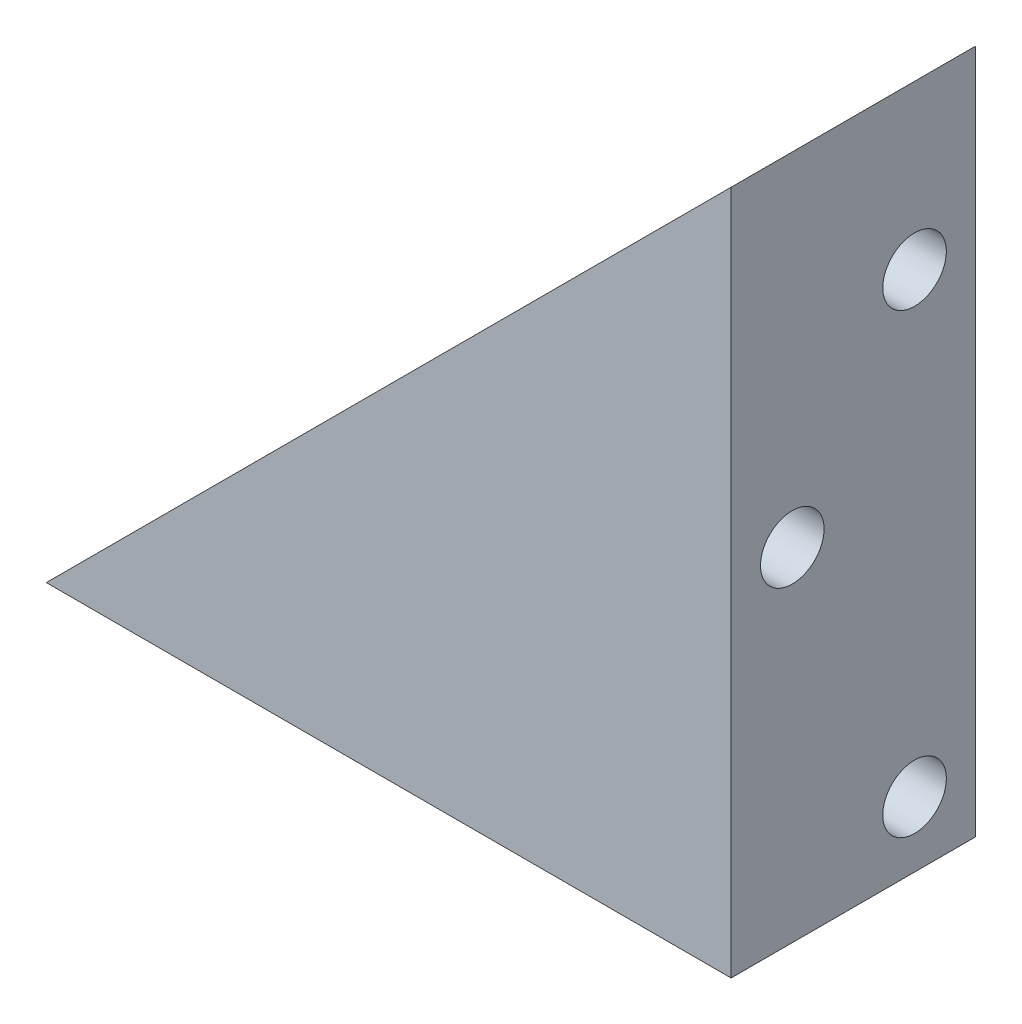
ISO-10303-21;
HEADER;
FILE_DESCRIPTION(('STEP AP214'),'2;1');
FILE_NAME('part.step','',(''),(''),'','','');
FILE_SCHEMA(('AUTOMOTIVE_DESIGN { 1 0 10303 214 1 1 1 1 }'));
ENDSEC;
DATA;
#1=APPLICATION_CONTEXT('core data for automotive mechanical design processes');
#2=APPLICATION_PROTOCOL_DEFINITION('international standard','automotive_design',2000,#1);
#3=PRODUCT_CONTEXT('',#1,'mechanical');
#4=PRODUCT('Part','Part','',(#3));
#5=PRODUCT_RELATED_PRODUCT_CATEGORY('part','',(#4));
#6=PRODUCT_DEFINITION_FORMATION('','',#4);
#7=PRODUCT_DEFINITION_CONTEXT('part definition',#1,'design');
#8=PRODUCT_DEFINITION('design','',#6,#7);
#9=PRODUCT_DEFINITION_SHAPE('','',#8);
#10=(LENGTH_UNIT() NAMED_UNIT(*) SI_UNIT(.MILLI.,.METRE.));
#11=(NAMED_UNIT(*) PLANE_ANGLE_UNIT() SI_UNIT($,.RADIAN.));
#12=(NAMED_UNIT(*) SI_UNIT($,.STERADIAN.) SOLID_ANGLE_UNIT());
#13=UNCERTAINTY_MEASURE_WITH_UNIT(LENGTH_MEASURE(1.E-05),#10,'distance_accuracy_value','');
#14=(GEOMETRIC_REPRESENTATION_CONTEXT(3) GLOBAL_UNCERTAINTY_ASSIGNED_CONTEXT((#13)) GLOBAL_UNIT_ASSIGNED_CONTEXT((#10,
#11,#12)) REPRESENTATION_CONTEXT('',''));
#15=CARTESIAN_POINT('',(0.,0.,0.));
#16=DIRECTION('',(0.,0.,1.));
#17=DIRECTION('',(1.,0.,0.));
#18=AXIS2_PLACEMENT_3D('',#15,#16,#17);
#19=CARTESIAN_POINT('',(42.,42.,15.));
#20=DIRECTION('',(0.707106781186547,-0.707106781186547,0.));
#21=DIRECTION('',(0.707106781186548,0.707106781186548,0.));
#22=AXIS2_PLACEMENT_3D('',#19,#20,#21);
#23=PLANE('',#22);
#24=CARTESIAN_POINT('',(21.,21.,7.5));
#25=DIRECTION('',(-0.707106781186548,0.707106781186547,0.));
#26=DIRECTION('',(-0.707106781186547,-0.707106781186548,0.));
#27=AXIS2_PLACEMENT_3D('',#24,#25,#26);
#28=CIRCLE('',#27,2.);
#29=CARTESIAN_POINT('',(19.5857864376269,19.5857864376269,7.5));
#30=VERTEX_POINT('',#29);
#31=EDGE_CURVE('E86',#30,#30,#28,.T.);
#32=ORIENTED_EDGE('',*,*,#31,.F.);
#33=EDGE_LOOP('',(#32));
#34=FACE_BOUND('',#33,.T.);
#35=DIRECTION('',(-0.707106781186548,-0.707106781186548,0.));
#36=VECTOR('',#35,1.);
#37=CARTESIAN_POINT('',(42.,42.,0.));
#38=LINE('',#37,#36);
#39=CARTESIAN_POINT('',(42.,42.,0.));
#40=VERTEX_POINT('',#39);
#41=CARTESIAN_POINT('',(0.,0.,0.));
#42=VERTEX_POINT('',#41);
#43=EDGE_CURVE('E79',#40,#42,#38,.T.);
#44=ORIENTED_EDGE('',*,*,#43,.T.);
#45=DIRECTION('',(0.,0.,-1.));
#46=VECTOR('',#45,1.);
#47=CARTESIAN_POINT('',(0.,0.,15.));
#48=LINE('',#47,#46);
#49=CARTESIAN_POINT('',(0.,0.,15.));
#50=VERTEX_POINT('',#49);
#51=EDGE_CURVE('E11',#50,#42,#48,.T.);
#52=ORIENTED_EDGE('',*,*,#51,.F.);
#53=DIRECTION('',(-0.707106781186548,-0.707106781186548,0.));
#54=VECTOR('',#53,1.);
#55=CARTESIAN_POINT('',(42.,42.,15.));
#56=LINE('',#55,#54);
#57=CARTESIAN_POINT('',(42.,42.,15.));
#58=VERTEX_POINT('',#57);
#59=EDGE_CURVE('E72',#58,#50,#56,.T.);
#60=ORIENTED_EDGE('',*,*,#59,.F.);
#61=DIRECTION('',(0.,0.,-1.));
#62=VECTOR('',#61,1.);
#63=CARTESIAN_POINT('',(42.,42.,15.));
#64=LINE('',#63,#62);
#65=EDGE_CURVE('E80',#58,#40,#64,.T.);
#66=ORIENTED_EDGE('',*,*,#65,.T.);
#67=EDGE_LOOP('',(#44,#52,#60,#66));
#68=FACE_BOUND('',#67,.T.);
#69=ADVANCED_FACE('F32',(#34,#68),#23,.F.);
#70=CARTESIAN_POINT('',(0.,0.,15.));
#71=DIRECTION('',(0.,1.,0.));
#72=DIRECTION('',(0.,0.,1.));
#73=AXIS2_PLACEMENT_3D('',#70,#71,#72);
#74=PLANE('',#73);
#75=DIRECTION('',(1.,0.,0.));
#76=VECTOR('',#75,1.);
#77=CARTESIAN_POINT('',(0.,0.,0.));
#78=LINE('',#77,#76);
#79=CARTESIAN_POINT('',(42.,0.,0.));
#80=VERTEX_POINT('',#79);
#81=EDGE_CURVE('E60',#42,#80,#78,.T.);
#82=ORIENTED_EDGE('',*,*,#81,.T.);
#83=DIRECTION('',(0.,0.,-1.));
#84=VECTOR('',#83,1.);
#85=CARTESIAN_POINT('',(42.,0.,15.));
#86=LINE('',#85,#84);
#87=CARTESIAN_POINT('',(42.,0.,15.));
#88=VERTEX_POINT('',#87);
#89=EDGE_CURVE('E40',#88,#80,#86,.T.);
#90=ORIENTED_EDGE('',*,*,#89,.F.);
#91=DIRECTION('',(1.,0.,0.));
#92=VECTOR('',#91,1.);
#93=CARTESIAN_POINT('',(0.,0.,15.));
#94=LINE('',#93,#92);
#95=EDGE_CURVE('E68',#50,#88,#94,.T.);
#96=ORIENTED_EDGE('',*,*,#95,.F.);
#97=ORIENTED_EDGE('',*,*,#51,.T.);
#98=EDGE_LOOP('',(#82,#90,#96,#97));
#99=FACE_BOUND('',#98,.T.);
#100=ADVANCED_FACE('F69',(#99),#74,.F.);
#101=CARTESIAN_POINT('',(42.,0.,15.));
#102=DIRECTION('',(-1.,0.,0.));
#103=DIRECTION('',(0.,0.,1.));
#104=AXIS2_PLACEMENT_3D('',#101,#102,#103);
#105=PLANE('',#104);
#106=CARTESIAN_POINT('',(42.,4.,3.75));
#107=DIRECTION('',(1.,0.,0.));
#108=DIRECTION('',(0.,0.,-1.));
#109=AXIS2_PLACEMENT_3D('',#106,#107,#108);
#110=CIRCLE('',#109,1.95);
#111=CARTESIAN_POINT('',(42.,4.,1.8));
#112=VERTEX_POINT('',#111);
#113=EDGE_CURVE('E128',#112,#112,#110,.T.);
#114=ORIENTED_EDGE('',*,*,#113,.F.);
#115=EDGE_LOOP('',(#114));
#116=FACE_BOUND('',#115,.T.);
#117=CARTESIAN_POINT('',(42.,32.,3.75));
#118=DIRECTION('',(1.,0.,0.));
#119=DIRECTION('',(0.,0.,-1.));
#120=AXIS2_PLACEMENT_3D('',#117,#118,#119);
#121=CIRCLE('',#120,1.95);
#122=CARTESIAN_POINT('',(42.,32.,1.8));
#123=VERTEX_POINT('',#122);
#124=EDGE_CURVE('E122',#123,#123,#121,.T.);
#125=ORIENTED_EDGE('',*,*,#124,.F.);
#126=EDGE_LOOP('',(#125));
#127=FACE_BOUND('',#126,.T.);
#128=CARTESIAN_POINT('',(42.,21.,11.25));
#129=DIRECTION('',(1.,0.,0.));
#130=DIRECTION('',(0.,0.,-1.));
#131=AXIS2_PLACEMENT_3D('',#128,#129,#130);
#132=CIRCLE('',#131,1.95);
#133=CARTESIAN_POINT('',(42.,21.,9.3));
#134=VERTEX_POINT('',#133);
#135=EDGE_CURVE('E116',#134,#134,#132,.T.);
#136=ORIENTED_EDGE('',*,*,#135,.F.);
#137=EDGE_LOOP('',(#136));
#138=FACE_BOUND('',#137,.T.);
#139=DIRECTION('',(0.,1.,0.));
#140=VECTOR('',#139,1.);
#141=CARTESIAN_POINT('',(42.,0.,0.));
#142=LINE('',#141,#140);
#143=EDGE_CURVE('E65',#80,#40,#142,.T.);
#144=ORIENTED_EDGE('',*,*,#143,.T.);
#145=ORIENTED_EDGE('',*,*,#65,.F.);
#146=DIRECTION('',(0.,1.,0.));
#147=VECTOR('',#146,1.);
#148=CARTESIAN_POINT('',(42.,0.,15.));
#149=LINE('',#148,#147);
#150=EDGE_CURVE('E48',#88,#58,#149,.T.);
#151=ORIENTED_EDGE('',*,*,#150,.F.);
#152=ORIENTED_EDGE('',*,*,#89,.T.);
#153=EDGE_LOOP('',(#144,#145,#151,#152));
#154=FACE_BOUND('',#153,.T.);
#155=ADVANCED_FACE('F91',(#116,#127,#138,#154),#105,.F.);
#156=CARTESIAN_POINT('',(0.,0.,15.));
#157=DIRECTION('',(0.,0.,1.));
#158=DIRECTION('',(1.,0.,0.));
#159=AXIS2_PLACEMENT_3D('',#156,#157,#158);
#160=PLANE('',#159);
#161=ORIENTED_EDGE('',*,*,#59,.T.);
#162=ORIENTED_EDGE('',*,*,#95,.T.);
#163=ORIENTED_EDGE('',*,*,#150,.T.);
#164=EDGE_LOOP('',(#161,#162,#163));
#165=FACE_BOUND('',#164,.T.);
#166=ADVANCED_FACE('F75',(#165),#160,.T.);
#167=CARTESIAN_POINT('',(0.,0.,0.));
#168=DIRECTION('',(0.,0.,1.));
#169=DIRECTION('',(1.,0.,0.));
#170=AXIS2_PLACEMENT_3D('',#167,#168,#169);
#171=PLANE('',#170);
#172=ORIENTED_EDGE('',*,*,#43,.F.);
#173=ORIENTED_EDGE('',*,*,#143,.F.);
#174=ORIENTED_EDGE('',*,*,#81,.F.);
#175=EDGE_LOOP('',(#172,#173,#174));
#176=FACE_BOUND('',#175,.T.);
#177=ADVANCED_FACE('F92',(#176),#171,.F.);
#178=CARTESIAN_POINT('',(35.1421356237309,6.85786437626905,7.5));
#179=DIRECTION('',(-0.707106781186548,0.707106781186548,0.));
#180=DIRECTION('',(-0.707106781186547,-0.707106781186548,0.));
#181=AXIS2_PLACEMENT_3D('',#178,#179,#180);
#182=CYLINDRICAL_SURFACE('',#181,2.);
#183=CARTESIAN_POINT('',(35.1421356237309,6.85786437626905,7.5));
#184=DIRECTION('',(-0.707106781186548,0.707106781186547,0.));
#185=DIRECTION('',(-0.707106781186547,-0.707106781186548,0.));
#186=AXIS2_PLACEMENT_3D('',#183,#184,#185);
#187=CIRCLE('',#186,2.);
#188=CARTESIAN_POINT('',(33.7279220613579,5.44365081389595,7.5));
#189=VERTEX_POINT('',#188);
#190=EDGE_CURVE('E82',#189,#189,#187,.T.);
#191=ORIENTED_EDGE('',*,*,#190,.F.);
#192=EDGE_LOOP('',(#191));
#193=FACE_BOUND('',#192,.T.);
#194=ORIENTED_EDGE('',*,*,#31,.T.);
#195=EDGE_LOOP('',(#194));
#196=FACE_BOUND('',#195,.T.);
#197=ADVANCED_FACE('F94',(#193,#196),#182,.F.);
#198=CARTESIAN_POINT('',(35.1421356237309,6.85786437626905,7.5));
#199=DIRECTION('',(-0.707106781186548,0.707106781186547,0.));
#200=DIRECTION('',(-0.707106781186547,-0.707106781186548,0.));
#201=AXIS2_PLACEMENT_3D('',#198,#199,#200);
#202=PLANE('',#201);
#203=ORIENTED_EDGE('',*,*,#190,.T.);
#204=EDGE_LOOP('',(#203));
#205=FACE_BOUND('',#204,.T.);
#206=ADVANCED_FACE('F100',(#205),#202,.T.);
#207=CARTESIAN_POINT('',(36.6,21.,11.25));
#208=DIRECTION('',(1.,0.,0.));
#209=DIRECTION('',(0.,0.,-1.));
#210=AXIS2_PLACEMENT_3D('',#207,#208,#209);
#211=CYLINDRICAL_SURFACE('',#210,1.95);
#212=CARTESIAN_POINT('',(36.6,21.,11.25));
#213=DIRECTION('',(1.,0.,0.));
#214=DIRECTION('',(0.,0.,-1.));
#215=AXIS2_PLACEMENT_3D('',#212,#213,#214);
#216=CIRCLE('',#215,1.95);
#217=CARTESIAN_POINT('',(36.6,21.,9.3));
#218=VERTEX_POINT('',#217);
#219=EDGE_CURVE('E113',#218,#218,#216,.T.);
#220=CARTESIAN_POINT('',(36.6,21.,9.3));
#221=CARTESIAN_POINT('',(36.65625,21.,9.3));
#222=CARTESIAN_POINT('',(36.7125,21.,9.3));
#223=CARTESIAN_POINT('',(36.825,21.,9.3));
#224=CARTESIAN_POINT('',(36.88125,21.,9.3));
#225=CARTESIAN_POINT('',(36.99375,21.,9.3));
#226=CARTESIAN_POINT('',(37.05,21.,9.3));
#227=CARTESIAN_POINT('',(37.1625,21.,9.3));
#228=CARTESIAN_POINT('',(37.21875,21.,9.3));
#229=CARTESIAN_POINT('',(37.33125,21.,9.3));
#230=CARTESIAN_POINT('',(37.3875,21.,9.3));
#231=CARTESIAN_POINT('',(37.5,21.,9.3));
#232=CARTESIAN_POINT('',(37.55625,21.,9.3));
#233=CARTESIAN_POINT('',(37.66875,21.,9.3));
#234=CARTESIAN_POINT('',(37.725,21.,9.3));
#235=CARTESIAN_POINT('',(37.8375,21.,9.3));
#236=CARTESIAN_POINT('',(37.89375,21.,9.3));
#237=CARTESIAN_POINT('',(38.00625,21.,9.3));
#238=CARTESIAN_POINT('',(38.0625,21.,9.3));
#239=CARTESIAN_POINT('',(38.175,21.,9.3));
#240=CARTESIAN_POINT('',(38.23125,21.,9.3));
#241=CARTESIAN_POINT('',(38.34375,21.,9.3));
#242=CARTESIAN_POINT('',(38.4,21.,9.3));
#243=CARTESIAN_POINT('',(38.5125,21.,9.3));
#244=CARTESIAN_POINT('',(38.56875,21.,9.3));
#245=CARTESIAN_POINT('',(38.68125,21.,9.3));
#246=CARTESIAN_POINT('',(38.7375,21.,9.3));
#247=CARTESIAN_POINT('',(38.85,21.,9.3));
#248=CARTESIAN_POINT('',(38.90625,21.,9.3));
#249=CARTESIAN_POINT('',(39.01875,21.,9.3));
#250=CARTESIAN_POINT('',(39.075,21.,9.3));
#251=CARTESIAN_POINT('',(39.1875,21.,9.3));
#252=CARTESIAN_POINT('',(39.24375,21.,9.3));
#253=CARTESIAN_POINT('',(39.35625,21.,9.3));
#254=CARTESIAN_POINT('',(39.4125,21.,9.3));
#255=CARTESIAN_POINT('',(39.525,21.,9.3));
#256=CARTESIAN_POINT('',(39.58125,21.,9.3));
#257=CARTESIAN_POINT('',(39.69375,21.,9.3));
#258=CARTESIAN_POINT('',(39.75,21.,9.3));
#259=CARTESIAN_POINT('',(39.8625,21.,9.3));
#260=CARTESIAN_POINT('',(39.91875,21.,9.3));
#261=CARTESIAN_POINT('',(40.03125,21.,9.3));
#262=CARTESIAN_POINT('',(40.0875,21.,9.3));
#263=CARTESIAN_POINT('',(40.2,21.,9.3));
#264=CARTESIAN_POINT('',(40.25625,21.,9.3));
#265=CARTESIAN_POINT('',(40.36875,21.,9.3));
#266=CARTESIAN_POINT('',(40.425,21.,9.3));
#267=CARTESIAN_POINT('',(40.5375,21.,9.3));
#268=CARTESIAN_POINT('',(40.59375,21.,9.3));
#269=CARTESIAN_POINT('',(40.70625,21.,9.3));
#270=CARTESIAN_POINT('',(40.7625,21.,9.3));
#271=CARTESIAN_POINT('',(40.875,21.,9.3));
#272=CARTESIAN_POINT('',(40.93125,21.,9.3));
#273=CARTESIAN_POINT('',(41.04375,21.,9.3));
#274=CARTESIAN_POINT('',(41.1,21.,9.3));
#275=CARTESIAN_POINT('',(41.2125,21.,9.3));
#276=CARTESIAN_POINT('',(41.26875,21.,9.3));
#277=CARTESIAN_POINT('',(41.38125,21.,9.3));
#278=CARTESIAN_POINT('',(41.4375,21.,9.3));
#279=CARTESIAN_POINT('',(41.55,21.,9.3));
#280=CARTESIAN_POINT('',(41.60625,21.,9.3));
#281=CARTESIAN_POINT('',(41.71875,21.,9.3));
#282=CARTESIAN_POINT('',(41.775,21.,9.3));
#283=CARTESIAN_POINT('',(41.8875,21.,9.3));
#284=CARTESIAN_POINT('',(41.94375,21.,9.3));
#285=CARTESIAN_POINT('',(42.,21.,9.3));
#286=B_SPLINE_CURVE_WITH_KNOTS('',3,(#220,#221,#222,#223,#224,#225,#226,#227,#228,#229,#230,
#231,#232,#233,#234,#235,#236,#237,#238,#239,#240,#241,#242,#243,#244,#245,#246,#247,#248,#249,
#250,#251,#252,#253,#254,#255,#256,#257,#258,#259,#260,#261,#262,#263,#264,#265,#266,#267,#268,
#269,#270,#271,#272,#273,#274,#275,#276,#277,#278,#279,#280,#281,#282,#283,#284,#285),
.UNSPECIFIED.,.F.,.F.,(4,2,2,2,2,2,2,2,2,2,2,2,2,2,2,2,2,2,2,2,2,2,2,2,2,2,2,2,2,2,2,2,4),(0.,
0.168749999999995,0.337499999999998,0.50625,0.674999999999995,0.843749999999997,1.0125,
1.18124999999999,1.35,1.51875,1.68749999999999,1.85625,2.025,2.19375,2.3625,2.53125,2.7,2.86875,
3.0375,3.20625,3.375,3.54375,3.7125,3.88125,4.05,4.21875,4.3875,4.55625,4.725,4.89375,5.0625,
5.23125,5.4),.UNSPECIFIED.);
#287=EDGE_CURVE('BSEAM149',#218,#134,#286,.T.);
#288=ORIENTED_EDGE('',*,*,#219,.F.);
#289=ORIENTED_EDGE('',*,*,#135,.T.);
#290=ORIENTED_EDGE('',*,*,#287,.T.);
#291=ORIENTED_EDGE('',*,*,#287,.F.);
#292=EDGE_LOOP('',(#288,#290,#289,#291));
#293=FACE_BOUND('',#292,.T.);
#294=ADVANCED_FACE('F149',(#293),#211,.F.);
#295=CARTESIAN_POINT('',(36.6,21.,11.25));
#296=DIRECTION('',(1.,0.,0.));
#297=DIRECTION('',(0.,0.,-1.));
#298=AXIS2_PLACEMENT_3D('',#295,#296,#297);
#299=PLANE('',#298);
#300=ORIENTED_EDGE('',*,*,#219,.T.);
#301=EDGE_LOOP('',(#300));
#302=FACE_BOUND('',#301,.T.);
#303=ADVANCED_FACE('F151',(#302),#299,.T.);
#304=CARTESIAN_POINT('',(36.6,32.,3.75));
#305=DIRECTION('',(1.,0.,0.));
#306=DIRECTION('',(0.,0.,-1.));
#307=AXIS2_PLACEMENT_3D('',#304,#305,#306);
#308=CYLINDRICAL_SURFACE('',#307,1.95);
#309=CARTESIAN_POINT('',(36.6,32.,3.75));
#310=DIRECTION('',(1.,0.,0.));
#311=DIRECTION('',(0.,0.,-1.));
#312=AXIS2_PLACEMENT_3D('',#309,#310,#311);
#313=CIRCLE('',#312,1.95);
#314=CARTESIAN_POINT('',(36.6,32.,1.8));
#315=VERTEX_POINT('',#314);
#316=EDGE_CURVE('E120',#315,#315,#313,.T.);
#317=CARTESIAN_POINT('',(36.6,32.,1.8));
#318=CARTESIAN_POINT('',(36.65625,32.,1.8));
#319=CARTESIAN_POINT('',(36.7125,32.,1.8));
#320=CARTESIAN_POINT('',(36.825,32.,1.8));
#321=CARTESIAN_POINT('',(36.88125,32.,1.8));
#322=CARTESIAN_POINT('',(36.99375,32.,1.8));
#323=CARTESIAN_POINT('',(37.05,32.,1.8));
#324=CARTESIAN_POINT('',(37.1625,32.,1.8));
#325=CARTESIAN_POINT('',(37.21875,32.,1.8));
#326=CARTESIAN_POINT('',(37.33125,32.,1.8));
#327=CARTESIAN_POINT('',(37.3875,32.,1.8));
#328=CARTESIAN_POINT('',(37.5,32.,1.8));
#329=CARTESIAN_POINT('',(37.55625,32.,1.8));
#330=CARTESIAN_POINT('',(37.66875,32.,1.8));
#331=CARTESIAN_POINT('',(37.725,32.,1.8));
#332=CARTESIAN_POINT('',(37.8375,32.,1.8));
#333=CARTESIAN_POINT('',(37.89375,32.,1.8));
#334=CARTESIAN_POINT('',(38.00625,32.,1.8));
#335=CARTESIAN_POINT('',(38.0625,32.,1.8));
#336=CARTESIAN_POINT('',(38.175,32.,1.8));
#337=CARTESIAN_POINT('',(38.23125,32.,1.8));
#338=CARTESIAN_POINT('',(38.34375,32.,1.8));
#339=CARTESIAN_POINT('',(38.4,32.,1.8));
#340=CARTESIAN_POINT('',(38.5125,32.,1.8));
#341=CARTESIAN_POINT('',(38.56875,32.,1.8));
#342=CARTESIAN_POINT('',(38.68125,32.,1.8));
#343=CARTESIAN_POINT('',(38.7375,32.,1.8));
#344=CARTESIAN_POINT('',(38.85,32.,1.8));
#345=CARTESIAN_POINT('',(38.90625,32.,1.8));
#346=CARTESIAN_POINT('',(39.01875,32.,1.8));
#347=CARTESIAN_POINT('',(39.075,32.,1.8));
#348=CARTESIAN_POINT('',(39.1875,32.,1.8));
#349=CARTESIAN_POINT('',(39.24375,32.,1.8));
#350=CARTESIAN_POINT('',(39.35625,32.,1.8));
#351=CARTESIAN_POINT('',(39.4125,32.,1.8));
#352=CARTESIAN_POINT('',(39.525,32.,1.8));
#353=CARTESIAN_POINT('',(39.58125,32.,1.8));
#354=CARTESIAN_POINT('',(39.69375,32.,1.8));
#355=CARTESIAN_POINT('',(39.75,32.,1.8));
#356=CARTESIAN_POINT('',(39.8625,32.,1.8));
#357=CARTESIAN_POINT('',(39.91875,32.,1.8));
#358=CARTESIAN_POINT('',(40.03125,32.,1.8));
#359=CARTESIAN_POINT('',(40.0875,32.,1.8));
#360=CARTESIAN_POINT('',(40.2,32.,1.8));
#361=CARTESIAN_POINT('',(40.25625,32.,1.8));
#362=CARTESIAN_POINT('',(40.36875,32.,1.8));
#363=CARTESIAN_POINT('',(40.425,32.,1.8));
#364=CARTESIAN_POINT('',(40.5375,32.,1.8));
#365=CARTESIAN_POINT('',(40.59375,32.,1.8));
#366=CARTESIAN_POINT('',(40.70625,32.,1.8));
#367=CARTESIAN_POINT('',(40.7625,32.,1.8));
#368=CARTESIAN_POINT('',(40.875,32.,1.8));
#369=CARTESIAN_POINT('',(40.93125,32.,1.8));
#370=CARTESIAN_POINT('',(41.04375,32.,1.8));
#371=CARTESIAN_POINT('',(41.1,32.,1.8));
#372=CARTESIAN_POINT('',(41.2125,32.,1.8));
#373=CARTESIAN_POINT('',(41.26875,32.,1.8));
#374=CARTESIAN_POINT('',(41.38125,32.,1.8));
#375=CARTESIAN_POINT('',(41.4375,32.,1.8));
#376=CARTESIAN_POINT('',(41.55,32.,1.8));
#377=CARTESIAN_POINT('',(41.60625,32.,1.8));
#378=CARTESIAN_POINT('',(41.71875,32.,1.8));
#379=CARTESIAN_POINT('',(41.775,32.,1.8));
#380=CARTESIAN_POINT('',(41.8875,32.,1.8));
#381=CARTESIAN_POINT('',(41.94375,32.,1.8));
#382=CARTESIAN_POINT('',(42.,32.,1.8));
#383=B_SPLINE_CURVE_WITH_KNOTS('',3,(#317,#318,#319,#320,#321,#322,#323,#324,#325,#326,#327,
#328,#329,#330,#331,#332,#333,#334,#335,#336,#337,#338,#339,#340,#341,#342,#343,#344,#345,#346,
#347,#348,#349,#350,#351,#352,#353,#354,#355,#356,#357,#358,#359,#360,#361,#362,#363,#364,#365,
#366,#367,#368,#369,#370,#371,#372,#373,#374,#375,#376,#377,#378,#379,#380,#381,#382),
.UNSPECIFIED.,.F.,.F.,(4,2,2,2,2,2,2,2,2,2,2,2,2,2,2,2,2,2,2,2,2,2,2,2,2,2,2,2,2,2,2,2,4),(0.,
0.168749999999995,0.337499999999998,0.50625,0.674999999999995,0.843749999999997,1.0125,
1.18124999999999,1.35,1.51875,1.68749999999999,1.85625,2.025,2.19375,2.3625,2.53125,2.7,2.86875,
3.0375,3.20625,3.375,3.54375,3.7125,3.88125,4.05,4.21875,4.3875,4.55625,4.725,4.89375,5.0625,
5.23125,5.4),.UNSPECIFIED.);
#384=EDGE_CURVE('BSEAM158',#315,#123,#383,.T.);
#385=ORIENTED_EDGE('',*,*,#316,.F.);
#386=ORIENTED_EDGE('',*,*,#124,.T.);
#387=ORIENTED_EDGE('',*,*,#384,.T.);
#388=ORIENTED_EDGE('',*,*,#384,.F.);
#389=EDGE_LOOP('',(#385,#387,#386,#388));
#390=FACE_BOUND('',#389,.T.);
#391=ADVANCED_FACE('F158',(#390),#308,.F.);
#392=CARTESIAN_POINT('',(36.6,32.,3.75));
#393=DIRECTION('',(1.,0.,0.));
#394=DIRECTION('',(0.,0.,-1.));
#395=AXIS2_PLACEMENT_3D('',#392,#393,#394);
#396=PLANE('',#395);
#397=ORIENTED_EDGE('',*,*,#316,.T.);
#398=EDGE_LOOP('',(#397));
#399=FACE_BOUND('',#398,.T.);
#400=ADVANCED_FACE('F139',(#399),#396,.T.);
#401=CARTESIAN_POINT('',(36.6,4.,3.75));
#402=DIRECTION('',(1.,0.,0.));
#403=DIRECTION('',(0.,0.,-1.));
#404=AXIS2_PLACEMENT_3D('',#401,#402,#403);
#405=CYLINDRICAL_SURFACE('',#404,1.95);
#406=CARTESIAN_POINT('',(36.6,4.,3.75));
#407=DIRECTION('',(1.,0.,0.));
#408=DIRECTION('',(0.,0.,-1.));
#409=AXIS2_PLACEMENT_3D('',#406,#407,#408);
#410=CIRCLE('',#409,1.95);
#411=CARTESIAN_POINT('',(36.6,4.,1.8));
#412=VERTEX_POINT('',#411);
#413=EDGE_CURVE('E125',#412,#412,#410,.T.);
#414=CARTESIAN_POINT('',(36.6,4.,1.8));
#415=CARTESIAN_POINT('',(36.65625,4.,1.8));
#416=CARTESIAN_POINT('',(36.7125,4.,1.8));
#417=CARTESIAN_POINT('',(36.825,4.,1.8));
#418=CARTESIAN_POINT('',(36.88125,4.,1.8));
#419=CARTESIAN_POINT('',(36.99375,4.,1.8));
#420=CARTESIAN_POINT('',(37.05,4.,1.8));
#421=CARTESIAN_POINT('',(37.1625,4.,1.8));
#422=CARTESIAN_POINT('',(37.21875,4.,1.8));
#423=CARTESIAN_POINT('',(37.33125,4.,1.8));
#424=CARTESIAN_POINT('',(37.3875,4.,1.8));
#425=CARTESIAN_POINT('',(37.5,4.,1.8));
#426=CARTESIAN_POINT('',(37.55625,4.,1.8));
#427=CARTESIAN_POINT('',(37.66875,4.,1.8));
#428=CARTESIAN_POINT('',(37.725,4.,1.8));
#429=CARTESIAN_POINT('',(37.8375,4.,1.8));
#430=CARTESIAN_POINT('',(37.89375,4.,1.8));
#431=CARTESIAN_POINT('',(38.00625,4.,1.8));
#432=CARTESIAN_POINT('',(38.0625,4.,1.8));
#433=CARTESIAN_POINT('',(38.175,4.,1.8));
#434=CARTESIAN_POINT('',(38.23125,4.,1.8));
#435=CARTESIAN_POINT('',(38.34375,4.,1.8));
#436=CARTESIAN_POINT('',(38.4,4.,1.8));
#437=CARTESIAN_POINT('',(38.5125,4.,1.8));
#438=CARTESIAN_POINT('',(38.56875,4.,1.8));
#439=CARTESIAN_POINT('',(38.68125,4.,1.8));
#440=CARTESIAN_POINT('',(38.7375,4.,1.8));
#441=CARTESIAN_POINT('',(38.85,4.,1.8));
#442=CARTESIAN_POINT('',(38.90625,4.,1.8));
#443=CARTESIAN_POINT('',(39.01875,4.,1.8));
#444=CARTESIAN_POINT('',(39.075,4.,1.8));
#445=CARTESIAN_POINT('',(39.1875,4.,1.8));
#446=CARTESIAN_POINT('',(39.24375,4.,1.8));
#447=CARTESIAN_POINT('',(39.35625,4.,1.8));
#448=CARTESIAN_POINT('',(39.4125,4.,1.8));
#449=CARTESIAN_POINT('',(39.525,4.,1.8));
#450=CARTESIAN_POINT('',(39.58125,4.,1.8));
#451=CARTESIAN_POINT('',(39.69375,4.,1.8));
#452=CARTESIAN_POINT('',(39.75,4.,1.8));
#453=CARTESIAN_POINT('',(39.8625,4.,1.8));
#454=CARTESIAN_POINT('',(39.91875,4.,1.8));
#455=CARTESIAN_POINT('',(40.03125,4.,1.8));
#456=CARTESIAN_POINT('',(40.0875,4.,1.8));
#457=CARTESIAN_POINT('',(40.2,4.,1.8));
#458=CARTESIAN_POINT('',(40.25625,4.,1.8));
#459=CARTESIAN_POINT('',(40.36875,4.,1.8));
#460=CARTESIAN_POINT('',(40.425,4.,1.8));
#461=CARTESIAN_POINT('',(40.5375,4.,1.8));
#462=CARTESIAN_POINT('',(40.59375,4.,1.8));
#463=CARTESIAN_POINT('',(40.70625,4.,1.8));
#464=CARTESIAN_POINT('',(40.7625,4.,1.8));
#465=CARTESIAN_POINT('',(40.875,4.,1.8));
#466=CARTESIAN_POINT('',(40.93125,4.,1.8));
#467=CARTESIAN_POINT('',(41.04375,4.,1.8));
#468=CARTESIAN_POINT('',(41.1,4.,1.8));
#469=CARTESIAN_POINT('',(41.2125,4.,1.8));
#470=CARTESIAN_POINT('',(41.26875,4.,1.8));
#471=CARTESIAN_POINT('',(41.38125,4.,1.8));
#472=CARTESIAN_POINT('',(41.4375,4.,1.8));
#473=CARTESIAN_POINT('',(41.55,4.,1.8));
#474=CARTESIAN_POINT('',(41.60625,4.,1.8));
#475=CARTESIAN_POINT('',(41.71875,4.,1.8));
#476=CARTESIAN_POINT('',(41.775,4.,1.8));
#477=CARTESIAN_POINT('',(41.8875,4.,1.8));
#478=CARTESIAN_POINT('',(41.94375,4.,1.8));
#479=CARTESIAN_POINT('',(42.,4.,1.8));
#480=B_SPLINE_CURVE_WITH_KNOTS('',3,(#414,#415,#416,#417,#418,#419,#420,#421,#422,#423,#424,
#425,#426,#427,#428,#429,#430,#431,#432,#433,#434,#435,#436,#437,#438,#439,#440,#441,#442,#443,
#444,#445,#446,#447,#448,#449,#450,#451,#452,#453,#454,#455,#456,#457,#458,#459,#460,#461,#462,
#463,#464,#465,#466,#467,#468,#469,#470,#471,#472,#473,#474,#475,#476,#477,#478,#479),
.UNSPECIFIED.,.F.,.F.,(4,2,2,2,2,2,2,2,2,2,2,2,2,2,2,2,2,2,2,2,2,2,2,2,2,2,2,2,2,2,2,2,4),(0.,
0.168749999999995,0.337499999999998,0.50625,0.674999999999995,0.843749999999997,1.0125,
1.18124999999999,1.35,1.51875,1.68749999999999,1.85625,2.025,2.19375,2.3625,2.53125,2.7,2.86875,
3.0375,3.20625,3.375,3.54375,3.7125,3.88125,4.05,4.21875,4.3875,4.55625,4.725,4.89375,5.0625,
5.23125,5.4),.UNSPECIFIED.);
#481=EDGE_CURVE('BSEAM136',#412,#112,#480,.T.);
#482=ORIENTED_EDGE('',*,*,#413,.F.);
#483=ORIENTED_EDGE('',*,*,#113,.T.);
#484=ORIENTED_EDGE('',*,*,#481,.T.);
#485=ORIENTED_EDGE('',*,*,#481,.F.);
#486=EDGE_LOOP('',(#482,#484,#483,#485));
#487=FACE_BOUND('',#486,.T.);
#488=ADVANCED_FACE('F136',(#487),#405,.F.);
#489=CARTESIAN_POINT('',(36.6,4.,3.75));
#490=DIRECTION('',(1.,0.,0.));
#491=DIRECTION('',(0.,0.,-1.));
#492=AXIS2_PLACEMENT_3D('',#489,#490,#491);
#493=PLANE('',#492);
#494=ORIENTED_EDGE('',*,*,#413,.T.);
#495=EDGE_LOOP('',(#494));
#496=FACE_BOUND('',#495,.T.);
#497=ADVANCED_FACE('F134',(#496),#493,.T.);
#498=CLOSED_SHELL('',(#69,#100,#155,#166,#177,#197,#206,#294,#303,#391,#400,#488,#497));
#499=MANIFOLD_SOLID_BREP('B2',#498);
#500=ADVANCED_BREP_SHAPE_REPRESENTATION('',(#18,#499),#14);
#501=SHAPE_DEFINITION_REPRESENTATION(#9,#500);
ENDSEC;
END-ISO-10303-21;
